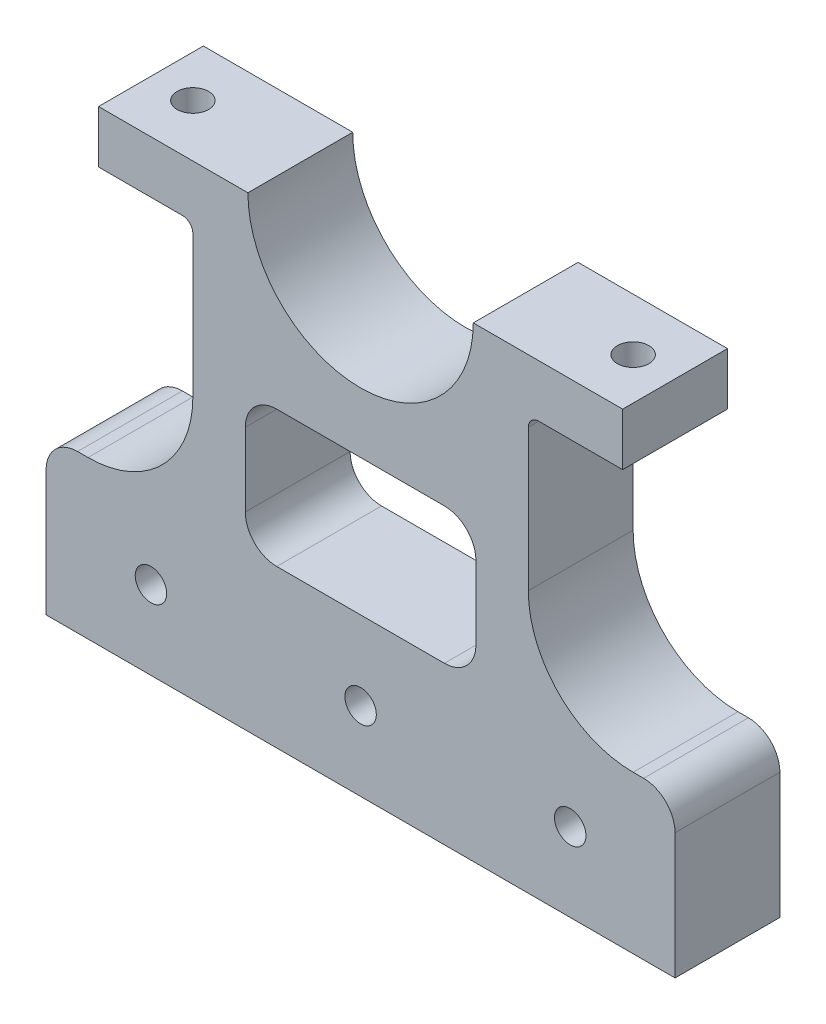
ISO-10303-21;
HEADER;
FILE_DESCRIPTION(('STEP AP214'),'2;1');
FILE_NAME('part.step','',(''),(''),'','','');
FILE_SCHEMA(('AUTOMOTIVE_DESIGN { 1 0 10303 214 1 1 1 1 }'));
ENDSEC;
DATA;
#1=APPLICATION_CONTEXT('core data for automotive mechanical design processes');
#2=APPLICATION_PROTOCOL_DEFINITION('international standard','automotive_design',2000,#1);
#3=PRODUCT_CONTEXT('',#1,'mechanical');
#4=PRODUCT('Part','Part','',(#3));
#5=PRODUCT_RELATED_PRODUCT_CATEGORY('part','',(#4));
#6=PRODUCT_DEFINITION_FORMATION('','',#4);
#7=PRODUCT_DEFINITION_CONTEXT('part definition',#1,'design');
#8=PRODUCT_DEFINITION('design','',#6,#7);
#9=PRODUCT_DEFINITION_SHAPE('','',#8);
#10=(LENGTH_UNIT() NAMED_UNIT(*) SI_UNIT(.MILLI.,.METRE.));
#11=(NAMED_UNIT(*) PLANE_ANGLE_UNIT() SI_UNIT($,.RADIAN.));
#12=(NAMED_UNIT(*) SI_UNIT($,.STERADIAN.) SOLID_ANGLE_UNIT());
#13=UNCERTAINTY_MEASURE_WITH_UNIT(LENGTH_MEASURE(1.E-05),#10,'distance_accuracy_value','');
#14=(GEOMETRIC_REPRESENTATION_CONTEXT(3) GLOBAL_UNCERTAINTY_ASSIGNED_CONTEXT((#13)) GLOBAL_UNIT_ASSIGNED_CONTEXT((#10,
#11,#12)) REPRESENTATION_CONTEXT('',''));
#15=CARTESIAN_POINT('',(0.,0.,0.));
#16=DIRECTION('',(0.,0.,1.));
#17=DIRECTION('',(1.,0.,0.));
#18=AXIS2_PLACEMENT_3D('',#15,#16,#17);
#19=CARTESIAN_POINT('',(-16.,44.5,10.));
#20=DIRECTION('',(0.,-1.,0.));
#21=DIRECTION('',(0.,0.,-1.));
#22=AXIS2_PLACEMENT_3D('',#19,#20,#21);
#23=PLANE('',#22);
#24=CARTESIAN_POINT('',(21.,44.5,5.));
#25=DIRECTION('',(0.,1.,0.));
#26=DIRECTION('',(0.,0.,-1.));
#27=AXIS2_PLACEMENT_3D('',#24,#25,#26);
#28=CIRCLE('',#27,1.5);
#29=CARTESIAN_POINT('',(21.,44.5,3.5));
#30=VERTEX_POINT('',#29);
#31=EDGE_CURVE('E661',#30,#30,#28,.T.);
#32=ORIENTED_EDGE('',*,*,#31,.F.);
#33=EDGE_LOOP('',(#32));
#34=FACE_BOUND('',#33,.T.);
#35=DIRECTION('',(-1.,0.,0.));
#36=VECTOR('',#35,1.);
#37=CARTESIAN_POINT('',(-16.,44.5,0.));
#38=LINE('',#37,#36);
#39=CARTESIAN_POINT('',(25.,44.5,0.));
#40=VERTEX_POINT('',#39);
#41=CARTESIAN_POINT('',(10.75,44.5,0.));
#42=VERTEX_POINT('',#41);
#43=EDGE_CURVE('E398',#40,#42,#38,.T.);
#44=ORIENTED_EDGE('',*,*,#43,.T.);
#45=DIRECTION('',(0.,0.,1.));
#46=VECTOR('',#45,1.);
#47=CARTESIAN_POINT('',(10.75,44.5,0.));
#48=LINE('',#47,#46);
#49=CARTESIAN_POINT('',(10.75,44.5,10.));
#50=VERTEX_POINT('',#49);
#51=EDGE_CURVE('E231',#42,#50,#48,.T.);
#52=ORIENTED_EDGE('',*,*,#51,.T.);
#53=DIRECTION('',(-1.,0.,0.));
#54=VECTOR('',#53,1.);
#55=CARTESIAN_POINT('',(-16.,44.5,10.));
#56=LINE('',#55,#54);
#57=CARTESIAN_POINT('',(25.,44.5,10.));
#58=VERTEX_POINT('',#57);
#59=EDGE_CURVE('E226',#58,#50,#56,.T.);
#60=ORIENTED_EDGE('',*,*,#59,.F.);
#61=DIRECTION('',(0.,0.,1.));
#62=VECTOR('',#61,1.);
#63=CARTESIAN_POINT('',(25.,44.5,-10.295630140987));
#64=LINE('',#63,#62);
#65=EDGE_CURVE('E229',#40,#58,#64,.T.);
#66=ORIENTED_EDGE('',*,*,#65,.F.);
#67=EDGE_LOOP('',(#44,#52,#60,#66));
#68=FACE_BOUND('',#67,.T.);
#69=ADVANCED_FACE('F41',(#34,#68),#23,.F.);
#70=CARTESIAN_POINT('',(-30.,0.,10.));
#71=DIRECTION('',(1.,0.,0.));
#72=DIRECTION('',(0.,0.,-1.));
#73=AXIS2_PLACEMENT_3D('',#70,#71,#72);
#74=PLANE('',#73);
#75=DIRECTION('',(0.,-1.,0.));
#76=VECTOR('',#75,1.);
#77=CARTESIAN_POINT('',(-30.,0.,10.));
#78=LINE('',#77,#76);
#79=CARTESIAN_POINT('',(-30.,12.,10.));
#80=VERTEX_POINT('',#79);
#81=CARTESIAN_POINT('',(-30.,0.,10.));
#82=VERTEX_POINT('',#81);
#83=EDGE_CURVE('E357',#80,#82,#78,.T.);
#84=ORIENTED_EDGE('',*,*,#83,.F.);
#85=DIRECTION('',(0.,0.,-1.));
#86=VECTOR('',#85,1.);
#87=CARTESIAN_POINT('',(-30.,12.,10.));
#88=LINE('',#87,#86);
#89=CARTESIAN_POINT('',(-30.,12.,0.));
#90=VERTEX_POINT('',#89);
#91=EDGE_CURVE('E447',#80,#90,#88,.T.);
#92=ORIENTED_EDGE('',*,*,#91,.T.);
#93=DIRECTION('',(0.,-1.,0.));
#94=VECTOR('',#93,1.);
#95=CARTESIAN_POINT('',(-30.,0.,0.));
#96=LINE('',#95,#94);
#97=CARTESIAN_POINT('',(-30.,0.,0.));
#98=VERTEX_POINT('',#97);
#99=EDGE_CURVE('E356',#90,#98,#96,.T.);
#100=ORIENTED_EDGE('',*,*,#99,.T.);
#101=DIRECTION('',(0.,0.,-1.));
#102=VECTOR('',#101,1.);
#103=CARTESIAN_POINT('',(-30.,0.,10.));
#104=LINE('',#103,#102);
#105=EDGE_CURVE('E410',#82,#98,#104,.T.);
#106=ORIENTED_EDGE('',*,*,#105,.F.);
#107=EDGE_LOOP('',(#84,#92,#100,#106));
#108=FACE_BOUND('',#107,.T.);
#109=ADVANCED_FACE('F585',(#108),#74,.F.);
#110=CARTESIAN_POINT('',(30.,0.,10.));
#111=DIRECTION('',(0.,1.,0.));
#112=DIRECTION('',(0.,0.,1.));
#113=AXIS2_PLACEMENT_3D('',#110,#111,#112);
#114=PLANE('',#113);
#115=DIRECTION('',(1.,0.,0.));
#116=VECTOR('',#115,1.);
#117=CARTESIAN_POINT('',(30.,0.,0.));
#118=LINE('',#117,#116);
#119=CARTESIAN_POINT('',(30.,0.,0.));
#120=VERTEX_POINT('',#119);
#121=EDGE_CURVE('E383',#98,#120,#118,.T.);
#122=ORIENTED_EDGE('',*,*,#121,.T.);
#123=DIRECTION('',(0.,0.,-1.));
#124=VECTOR('',#123,1.);
#125=CARTESIAN_POINT('',(30.,0.,10.));
#126=LINE('',#125,#124);
#127=CARTESIAN_POINT('',(30.,0.,10.));
#128=VERTEX_POINT('',#127);
#129=EDGE_CURVE('E380',#128,#120,#126,.T.);
#130=ORIENTED_EDGE('',*,*,#129,.F.);
#131=DIRECTION('',(1.,0.,0.));
#132=VECTOR('',#131,1.);
#133=CARTESIAN_POINT('',(30.,0.,10.));
#134=LINE('',#133,#132);
#135=EDGE_CURVE('E360',#82,#128,#134,.T.);
#136=ORIENTED_EDGE('',*,*,#135,.F.);
#137=ORIENTED_EDGE('',*,*,#105,.T.);
#138=EDGE_LOOP('',(#122,#130,#136,#137));
#139=FACE_BOUND('',#138,.T.);
#140=ADVANCED_FACE('F588',(#139),#114,.F.);
#141=CARTESIAN_POINT('',(30.,0.,10.));
#142=DIRECTION('',(-1.,0.,0.));
#143=DIRECTION('',(0.,0.,1.));
#144=AXIS2_PLACEMENT_3D('',#141,#142,#143);
#145=PLANE('',#144);
#146=DIRECTION('',(0.,1.,0.));
#147=VECTOR('',#146,1.);
#148=CARTESIAN_POINT('',(30.,0.,0.));
#149=LINE('',#148,#147);
#150=CARTESIAN_POINT('',(30.,12.,0.));
#151=VERTEX_POINT('',#150);
#152=EDGE_CURVE('E386',#120,#151,#149,.T.);
#153=ORIENTED_EDGE('',*,*,#152,.T.);
#154=DIRECTION('',(0.,0.,-1.));
#155=VECTOR('',#154,1.);
#156=CARTESIAN_POINT('',(30.,12.,10.));
#157=LINE('',#156,#155);
#158=CARTESIAN_POINT('',(30.,12.,10.));
#159=VERTEX_POINT('',#158);
#160=EDGE_CURVE('E470',#151,#159,#157,.F.);
#161=ORIENTED_EDGE('',*,*,#160,.T.);
#162=DIRECTION('',(0.,1.,0.));
#163=VECTOR('',#162,1.);
#164=CARTESIAN_POINT('',(30.,0.,10.));
#165=LINE('',#164,#163);
#166=EDGE_CURVE('E364',#128,#159,#165,.T.);
#167=ORIENTED_EDGE('',*,*,#166,.F.);
#168=ORIENTED_EDGE('',*,*,#129,.T.);
#169=EDGE_LOOP('',(#153,#161,#167,#168));
#170=FACE_BOUND('',#169,.T.);
#171=ADVANCED_FACE('F844',(#170),#145,.F.);
#172=CARTESIAN_POINT('',(30.,15.,10.));
#173=DIRECTION('',(0.,-1.,0.));
#174=DIRECTION('',(1.,0.,0.));
#175=AXIS2_PLACEMENT_3D('',#172,#173,#174);
#176=PLANE('',#175);
#177=DIRECTION('',(-1.,0.,0.));
#178=VECTOR('',#177,1.);
#179=CARTESIAN_POINT('',(30.,15.,10.));
#180=LINE('',#179,#178);
#181=CARTESIAN_POINT('',(27.,15.,10.));
#182=VERTEX_POINT('',#181);
#183=CARTESIAN_POINT('',(26.,15.,10.));
#184=VERTEX_POINT('',#183);
#185=EDGE_CURVE('E368',#182,#184,#180,.T.);
#186=ORIENTED_EDGE('',*,*,#185,.F.);
#187=DIRECTION('',(0.,0.,-1.));
#188=VECTOR('',#187,1.);
#189=CARTESIAN_POINT('',(27.,15.,10.));
#190=LINE('',#189,#188);
#191=CARTESIAN_POINT('',(27.,15.,0.));
#192=VERTEX_POINT('',#191);
#193=EDGE_CURVE('E466',#182,#192,#190,.T.);
#194=ORIENTED_EDGE('',*,*,#193,.T.);
#195=DIRECTION('',(-1.,0.,0.));
#196=VECTOR('',#195,1.);
#197=CARTESIAN_POINT('',(30.,15.,0.));
#198=LINE('',#197,#196);
#199=CARTESIAN_POINT('',(26.,15.,0.));
#200=VERTEX_POINT('',#199);
#201=EDGE_CURVE('E390',#192,#200,#198,.T.);
#202=ORIENTED_EDGE('',*,*,#201,.T.);
#203=DIRECTION('',(0.,0.,-1.));
#204=VECTOR('',#203,1.);
#205=CARTESIAN_POINT('',(26.,15.,10.));
#206=LINE('',#205,#204);
#207=EDGE_CURVE('E421',#200,#184,#206,.F.);
#208=ORIENTED_EDGE('',*,*,#207,.T.);
#209=EDGE_LOOP('',(#186,#194,#202,#208));
#210=FACE_BOUND('',#209,.T.);
#211=ADVANCED_FACE('F600',(#210),#176,.F.);
#212=CARTESIAN_POINT('',(16.,15.,10.));
#213=DIRECTION('',(-1.,0.,0.));
#214=DIRECTION('',(0.,0.,1.));
#215=AXIS2_PLACEMENT_3D('',#212,#213,#214);
#216=PLANE('',#215);
#217=DIRECTION('',(0.,1.,0.));
#218=VECTOR('',#217,1.);
#219=CARTESIAN_POINT('',(16.,15.,0.));
#220=LINE('',#219,#218);
#221=CARTESIAN_POINT('',(16.,25.,0.));
#222=VERTEX_POINT('',#221);
#223=CARTESIAN_POINT('',(16.,38.5,0.));
#224=VERTEX_POINT('',#223);
#225=EDGE_CURVE('E393',#222,#224,#220,.T.);
#226=ORIENTED_EDGE('',*,*,#225,.T.);
#227=DIRECTION('',(0.,0.,1.));
#228=VECTOR('',#227,1.);
#229=CARTESIAN_POINT('',(16.,38.5,10.));
#230=LINE('',#229,#228);
#231=CARTESIAN_POINT('',(16.,38.5,10.));
#232=VERTEX_POINT('',#231);
#233=EDGE_CURVE('E525',#224,#232,#230,.T.);
#234=ORIENTED_EDGE('',*,*,#233,.T.);
#235=DIRECTION('',(0.,1.,0.));
#236=VECTOR('',#235,1.);
#237=CARTESIAN_POINT('',(16.,15.,10.));
#238=LINE('',#237,#236);
#239=CARTESIAN_POINT('',(16.,25.,10.));
#240=VERTEX_POINT('',#239);
#241=EDGE_CURVE('E371',#240,#232,#238,.T.);
#242=ORIENTED_EDGE('',*,*,#241,.F.);
#243=DIRECTION('',(0.,0.,-1.));
#244=VECTOR('',#243,1.);
#245=CARTESIAN_POINT('',(16.,25.,0.));
#246=LINE('',#245,#244);
#247=EDGE_CURVE('E417',#240,#222,#246,.T.);
#248=ORIENTED_EDGE('',*,*,#247,.T.);
#249=EDGE_LOOP('',(#226,#234,#242,#248));
#250=FACE_BOUND('',#249,.T.);
#251=ADVANCED_FACE('F610',(#250),#216,.F.);
#252=CARTESIAN_POINT('',(-21.,44.5,5.));
#253=DIRECTION('',(0.,1.,0.));
#254=DIRECTION('',(0.,0.,1.));
#255=AXIS2_PLACEMENT_3D('',#252,#253,#254);
#256=CIRCLE('',#255,1.5);
#257=CARTESIAN_POINT('',(-21.,44.5,6.5));
#258=VERTEX_POINT('',#257);
#259=EDGE_CURVE('E652',#258,#258,#256,.T.);
#260=ORIENTED_EDGE('',*,*,#259,.F.);
#261=EDGE_LOOP('',(#260));
#262=FACE_BOUND('',#261,.T.);
#263=CARTESIAN_POINT('',(-10.75,44.5,10.));
#264=VERTEX_POINT('',#263);
#265=CARTESIAN_POINT('',(-25.,44.5,10.));
#266=VERTEX_POINT('',#265);
#267=EDGE_CURVE('E236',#264,#266,#56,.T.);
#268=ORIENTED_EDGE('',*,*,#267,.F.);
#269=DIRECTION('',(0.,0.,1.));
#270=VECTOR('',#269,1.);
#271=CARTESIAN_POINT('',(-10.75,44.5,0.));
#272=LINE('',#271,#270);
#273=CARTESIAN_POINT('',(-10.75,44.5,0.));
#274=VERTEX_POINT('',#273);
#275=EDGE_CURVE('E350',#264,#274,#272,.F.);
#276=ORIENTED_EDGE('',*,*,#275,.T.);
#277=CARTESIAN_POINT('',(-25.,44.5,0.));
#278=VERTEX_POINT('',#277);
#279=EDGE_CURVE('E397',#274,#278,#38,.T.);
#280=ORIENTED_EDGE('',*,*,#279,.T.);
#281=DIRECTION('',(0.,0.,1.));
#282=VECTOR('',#281,1.);
#283=CARTESIAN_POINT('',(-25.,44.5,-10.295630140987));
#284=LINE('',#283,#282);
#285=EDGE_CURVE('E273',#278,#266,#284,.T.);
#286=ORIENTED_EDGE('',*,*,#285,.T.);
#287=EDGE_LOOP('',(#268,#276,#280,#286));
#288=FACE_BOUND('',#287,.T.);
#289=ADVANCED_FACE('F550',(#262,#288),#23,.F.);
#290=CARTESIAN_POINT('',(-16.,15.,10.));
#291=DIRECTION('',(1.,0.,0.));
#292=DIRECTION('',(0.,0.,-1.));
#293=AXIS2_PLACEMENT_3D('',#290,#291,#292);
#294=PLANE('',#293);
#295=DIRECTION('',(0.,-1.,0.));
#296=VECTOR('',#295,1.);
#297=CARTESIAN_POINT('',(-16.,15.,10.));
#298=LINE('',#297,#296);
#299=CARTESIAN_POINT('',(-16.,38.5,10.));
#300=VERTEX_POINT('',#299);
#301=CARTESIAN_POINT('',(-16.,25.,10.));
#302=VERTEX_POINT('',#301);
#303=EDGE_CURVE('E235',#300,#302,#298,.T.);
#304=ORIENTED_EDGE('',*,*,#303,.F.);
#305=DIRECTION('',(0.,0.,1.));
#306=VECTOR('',#305,1.);
#307=CARTESIAN_POINT('',(-16.,38.5,10.));
#308=LINE('',#307,#306);
#309=CARTESIAN_POINT('',(-16.,38.5,0.));
#310=VERTEX_POINT('',#309);
#311=EDGE_CURVE('E57',#300,#310,#308,.F.);
#312=ORIENTED_EDGE('',*,*,#311,.T.);
#313=DIRECTION('',(0.,-1.,0.));
#314=VECTOR('',#313,1.);
#315=CARTESIAN_POINT('',(-16.,15.,0.));
#316=LINE('',#315,#314);
#317=CARTESIAN_POINT('',(-16.,25.,0.));
#318=VERTEX_POINT('',#317);
#319=EDGE_CURVE('E401',#310,#318,#316,.T.);
#320=ORIENTED_EDGE('',*,*,#319,.T.);
#321=DIRECTION('',(0.,0.,-1.));
#322=VECTOR('',#321,1.);
#323=CARTESIAN_POINT('',(-16.,25.,10.));
#324=LINE('',#323,#322);
#325=EDGE_CURVE('E429',#318,#302,#324,.F.);
#326=ORIENTED_EDGE('',*,*,#325,.T.);
#327=EDGE_LOOP('',(#304,#312,#320,#326));
#328=FACE_BOUND('',#327,.T.);
#329=ADVANCED_FACE('F568',(#328),#294,.F.);
#330=CARTESIAN_POINT('',(-30.,15.,10.));
#331=DIRECTION('',(0.,-1.,0.));
#332=DIRECTION('',(1.,0.,0.));
#333=AXIS2_PLACEMENT_3D('',#330,#331,#332);
#334=PLANE('',#333);
#335=DIRECTION('',(-1.,0.,0.));
#336=VECTOR('',#335,1.);
#337=CARTESIAN_POINT('',(-30.,15.,0.));
#338=LINE('',#337,#336);
#339=CARTESIAN_POINT('',(-26.,15.,0.));
#340=VERTEX_POINT('',#339);
#341=CARTESIAN_POINT('',(-27.,15.,0.));
#342=VERTEX_POINT('',#341);
#343=EDGE_CURVE('E361',#340,#342,#338,.T.);
#344=ORIENTED_EDGE('',*,*,#343,.T.);
#345=DIRECTION('',(0.,0.,-1.));
#346=VECTOR('',#345,1.);
#347=CARTESIAN_POINT('',(-27.,15.,10.));
#348=LINE('',#347,#346);
#349=CARTESIAN_POINT('',(-27.,15.,10.));
#350=VERTEX_POINT('',#349);
#351=EDGE_CURVE('E457',#342,#350,#348,.F.);
#352=ORIENTED_EDGE('',*,*,#351,.T.);
#353=DIRECTION('',(-1.,0.,0.));
#354=VECTOR('',#353,1.);
#355=CARTESIAN_POINT('',(-30.,15.,10.));
#356=LINE('',#355,#354);
#357=CARTESIAN_POINT('',(-26.,15.,10.));
#358=VERTEX_POINT('',#357);
#359=EDGE_CURVE('E377',#358,#350,#356,.T.);
#360=ORIENTED_EDGE('',*,*,#359,.F.);
#361=DIRECTION('',(0.,0.,-1.));
#362=VECTOR('',#361,1.);
#363=CARTESIAN_POINT('',(-26.,15.,0.));
#364=LINE('',#363,#362);
#365=EDGE_CURVE('E425',#358,#340,#364,.T.);
#366=ORIENTED_EDGE('',*,*,#365,.T.);
#367=EDGE_LOOP('',(#344,#352,#360,#366));
#368=FACE_BOUND('',#367,.T.);
#369=ADVANCED_FACE('F576',(#368),#334,.F.);
#370=CARTESIAN_POINT('',(0.,0.,10.));
#371=DIRECTION('',(0.,0.,-1.));
#372=DIRECTION('',(-1.,0.,0.));
#373=AXIS2_PLACEMENT_3D('',#370,#371,#372);
#374=PLANE('',#373);
#375=DIRECTION('',(-1.,0.,0.));
#376=VECTOR('',#375,1.);
#377=CARTESIAN_POINT('',(-11.,28.,10.));
#378=LINE('',#377,#376);
#379=CARTESIAN_POINT('',(7.99999999999999,28.,10.));
#380=VERTEX_POINT('',#379);
#381=CARTESIAN_POINT('',(-8.00000000000001,28.,10.));
#382=VERTEX_POINT('',#381);
#383=EDGE_CURVE('E313',#380,#382,#378,.T.);
#384=ORIENTED_EDGE('',*,*,#383,.F.);
#385=CARTESIAN_POINT('',(7.99999999999999,25.,10.));
#386=DIRECTION('',(0.,0.,-1.));
#387=DIRECTION('',(-1.,0.,0.));
#388=AXIS2_PLACEMENT_3D('',#385,#386,#387);
#389=CIRCLE('',#388,3.);
#390=CARTESIAN_POINT('',(11.,25.,10.));
#391=VERTEX_POINT('',#390);
#392=EDGE_CURVE('E513',#380,#391,#389,.T.);
#393=ORIENTED_EDGE('',*,*,#392,.T.);
#394=DIRECTION('',(0.,1.,0.));
#395=VECTOR('',#394,1.);
#396=CARTESIAN_POINT('',(11.,28.,10.));
#397=LINE('',#396,#395);
#398=CARTESIAN_POINT('',(11.,18.,10.));
#399=VERTEX_POINT('',#398);
#400=EDGE_CURVE('E281',#399,#391,#397,.T.);
#401=ORIENTED_EDGE('',*,*,#400,.F.);
#402=CARTESIAN_POINT('',(8.,18.,10.));
#403=DIRECTION('',(0.,0.,-1.));
#404=DIRECTION('',(-1.,0.,0.));
#405=AXIS2_PLACEMENT_3D('',#402,#403,#404);
#406=CIRCLE('',#405,3.);
#407=CARTESIAN_POINT('',(8.,15.,10.));
#408=VERTEX_POINT('',#407);
#409=EDGE_CURVE('E507',#399,#408,#406,.T.);
#410=ORIENTED_EDGE('',*,*,#409,.T.);
#411=DIRECTION('',(1.,0.,0.));
#412=VECTOR('',#411,1.);
#413=CARTESIAN_POINT('',(-11.,15.,10.));
#414=LINE('',#413,#412);
#415=CARTESIAN_POINT('',(-8.,15.,10.));
#416=VERTEX_POINT('',#415);
#417=EDGE_CURVE('E297',#416,#408,#414,.T.);
#418=ORIENTED_EDGE('',*,*,#417,.F.);
#419=CARTESIAN_POINT('',(-8.,18.,10.));
#420=DIRECTION('',(0.,0.,-1.));
#421=DIRECTION('',(-1.,0.,0.));
#422=AXIS2_PLACEMENT_3D('',#419,#420,#421);
#423=CIRCLE('',#422,3.);
#424=CARTESIAN_POINT('',(-11.,18.,10.));
#425=VERTEX_POINT('',#424);
#426=EDGE_CURVE('E501',#416,#425,#423,.T.);
#427=ORIENTED_EDGE('',*,*,#426,.T.);
#428=DIRECTION('',(0.,-1.,0.));
#429=VECTOR('',#428,1.);
#430=CARTESIAN_POINT('',(-11.,28.,10.));
#431=LINE('',#430,#429);
#432=CARTESIAN_POINT('',(-11.,25.,10.));
#433=VERTEX_POINT('',#432);
#434=EDGE_CURVE('E317',#433,#425,#431,.T.);
#435=ORIENTED_EDGE('',*,*,#434,.F.);
#436=CARTESIAN_POINT('',(-8.00000000000001,25.,10.));
#437=DIRECTION('',(0.,0.,-1.));
#438=DIRECTION('',(-1.,0.,0.));
#439=AXIS2_PLACEMENT_3D('',#436,#437,#438);
#440=CIRCLE('',#439,3.);
#441=EDGE_CURVE('E519',#433,#382,#440,.T.);
#442=ORIENTED_EDGE('',*,*,#441,.T.);
#443=EDGE_LOOP('',(#384,#393,#401,#410,#418,#427,#435,#442));
#444=FACE_BOUND('',#443,.T.);
#445=CARTESIAN_POINT('',(-20.,7.49999999999998,10.));
#446=DIRECTION('',(0.,0.,1.));
#447=DIRECTION('',(1.,0.,0.));
#448=AXIS2_PLACEMENT_3D('',#445,#446,#447);
#449=CIRCLE('',#448,1.5);
#450=CARTESIAN_POINT('',(-18.5,7.49999999999998,10.));
#451=VERTEX_POINT('',#450);
#452=EDGE_CURVE('E329',#451,#451,#449,.T.);
#453=ORIENTED_EDGE('',*,*,#452,.F.);
#454=EDGE_LOOP('',(#453));
#455=FACE_BOUND('',#454,.T.);
#456=CARTESIAN_POINT('',(0.,7.49999999999999,10.));
#457=DIRECTION('',(0.,0.,1.));
#458=DIRECTION('',(1.,0.,0.));
#459=AXIS2_PLACEMENT_3D('',#456,#457,#458);
#460=CIRCLE('',#459,1.5);
#461=CARTESIAN_POINT('',(1.5,7.49999999999999,10.));
#462=VERTEX_POINT('',#461);
#463=EDGE_CURVE('E337',#462,#462,#460,.T.);
#464=ORIENTED_EDGE('',*,*,#463,.F.);
#465=EDGE_LOOP('',(#464));
#466=FACE_BOUND('',#465,.T.);
#467=CARTESIAN_POINT('',(20.,7.49999999999998,10.));
#468=DIRECTION('',(0.,0.,1.));
#469=DIRECTION('',(1.,0.,0.));
#470=AXIS2_PLACEMENT_3D('',#467,#468,#469);
#471=CIRCLE('',#470,1.5);
#472=CARTESIAN_POINT('',(21.5,7.49999999999998,10.));
#473=VERTEX_POINT('',#472);
#474=EDGE_CURVE('E309',#473,#473,#471,.T.);
#475=ORIENTED_EDGE('',*,*,#474,.F.);
#476=EDGE_LOOP('',(#475));
#477=FACE_BOUND('',#476,.T.);
#478=ORIENTED_EDGE('',*,*,#359,.T.);
#479=CARTESIAN_POINT('',(-27.,12.,10.));
#480=DIRECTION('',(0.,0.,-1.));
#481=DIRECTION('',(-1.,0.,0.));
#482=AXIS2_PLACEMENT_3D('',#479,#480,#481);
#483=CIRCLE('',#482,3.);
#484=EDGE_CURVE('E463',#350,#80,#483,.F.);
#485=ORIENTED_EDGE('',*,*,#484,.T.);
#486=ORIENTED_EDGE('',*,*,#83,.T.);
#487=ORIENTED_EDGE('',*,*,#135,.T.);
#488=ORIENTED_EDGE('',*,*,#166,.T.);
#489=CARTESIAN_POINT('',(27.,12.,10.));
#490=DIRECTION('',(0.,0.,-1.));
#491=DIRECTION('',(-1.,0.,0.));
#492=AXIS2_PLACEMENT_3D('',#489,#490,#491);
#493=CIRCLE('',#492,3.);
#494=EDGE_CURVE('E460',#159,#182,#493,.F.);
#495=ORIENTED_EDGE('',*,*,#494,.T.);
#496=ORIENTED_EDGE('',*,*,#185,.T.);
#497=CARTESIAN_POINT('',(26.,25.,10.));
#498=DIRECTION('',(0.,0.,-1.));
#499=DIRECTION('',(-1.,0.,0.));
#500=AXIS2_PLACEMENT_3D('',#497,#498,#499);
#501=CIRCLE('',#500,10.);
#502=EDGE_CURVE('E437',#184,#240,#501,.T.);
#503=ORIENTED_EDGE('',*,*,#502,.T.);
#504=ORIENTED_EDGE('',*,*,#241,.T.);
#505=CARTESIAN_POINT('',(17.,38.5,10.));
#506=DIRECTION('',(0.,0.,-1.));
#507=DIRECTION('',(-1.,0.,0.));
#508=AXIS2_PLACEMENT_3D('',#505,#506,#507);
#509=CIRCLE('',#508,1.);
#510=CARTESIAN_POINT('',(17.,39.5,10.));
#511=VERTEX_POINT('',#510);
#512=EDGE_CURVE('E538',#232,#511,#509,.T.);
#513=ORIENTED_EDGE('',*,*,#512,.T.);
#514=DIRECTION('',(1.,0.,0.));
#515=VECTOR('',#514,1.);
#516=CARTESIAN_POINT('',(16.,39.5,10.));
#517=LINE('',#516,#515);
#518=CARTESIAN_POINT('',(25.,39.5,10.));
#519=VERTEX_POINT('',#518);
#520=EDGE_CURVE('E251',#511,#519,#517,.T.);
#521=ORIENTED_EDGE('',*,*,#520,.T.);
#522=DIRECTION('',(0.,1.,0.));
#523=VECTOR('',#522,1.);
#524=CARTESIAN_POINT('',(25.,44.5,10.));
#525=LINE('',#524,#523);
#526=EDGE_CURVE('E242',#519,#58,#525,.T.);
#527=ORIENTED_EDGE('',*,*,#526,.T.);
#528=ORIENTED_EDGE('',*,*,#59,.T.);
#529=CARTESIAN_POINT('',(0.,44.5,10.));
#530=DIRECTION('',(0.,0.,1.));
#531=DIRECTION('',(1.,0.,0.));
#532=AXIS2_PLACEMENT_3D('',#529,#530,#531);
#533=CIRCLE('',#532,10.75);
#534=EDGE_CURVE('E328',#264,#50,#533,.T.);
#535=ORIENTED_EDGE('',*,*,#534,.F.);
#536=ORIENTED_EDGE('',*,*,#267,.T.);
#537=DIRECTION('',(0.,-1.,0.));
#538=VECTOR('',#537,1.);
#539=CARTESIAN_POINT('',(-25.,44.5,10.));
#540=LINE('',#539,#538);
#541=CARTESIAN_POINT('',(-25.,39.5,10.));
#542=VERTEX_POINT('',#541);
#543=EDGE_CURVE('E246',#266,#542,#540,.T.);
#544=ORIENTED_EDGE('',*,*,#543,.T.);
#545=DIRECTION('',(1.,0.,0.));
#546=VECTOR('',#545,1.);
#547=CARTESIAN_POINT('',(-16.,39.5,10.));
#548=LINE('',#547,#546);
#549=CARTESIAN_POINT('',(-17.,39.5,10.));
#550=VERTEX_POINT('',#549);
#551=EDGE_CURVE('E270',#542,#550,#548,.T.);
#552=ORIENTED_EDGE('',*,*,#551,.T.);
#553=CARTESIAN_POINT('',(-17.,38.5,10.));
#554=DIRECTION('',(0.,0.,-1.));
#555=DIRECTION('',(-1.,0.,0.));
#556=AXIS2_PLACEMENT_3D('',#553,#554,#555);
#557=CIRCLE('',#556,1.);
#558=EDGE_CURVE('E50',#550,#300,#557,.T.);
#559=ORIENTED_EDGE('',*,*,#558,.T.);
#560=ORIENTED_EDGE('',*,*,#303,.T.);
#561=CARTESIAN_POINT('',(-26.,25.,10.));
#562=DIRECTION('',(0.,0.,-1.));
#563=DIRECTION('',(-1.,0.,0.));
#564=AXIS2_PLACEMENT_3D('',#561,#562,#563);
#565=CIRCLE('',#564,10.);
#566=EDGE_CURVE('E444',#302,#358,#565,.T.);
#567=ORIENTED_EDGE('',*,*,#566,.T.);
#568=EDGE_LOOP('',(#478,#485,#486,#487,#488,#495,#496,#503,#504,#513,#521,#527,#528,#535,#536,
#544,#552,#559,#560,#567));
#569=FACE_BOUND('',#568,.T.);
#570=ADVANCED_FACE('F249',(#444,#455,#466,#477,#569),#374,.F.);
#571=CARTESIAN_POINT('',(0.,0.,0.));
#572=DIRECTION('',(0.,0.,-1.));
#573=DIRECTION('',(-1.,0.,0.));
#574=AXIS2_PLACEMENT_3D('',#571,#572,#573);
#575=PLANE('',#574);
#576=DIRECTION('',(1.,0.,0.));
#577=VECTOR('',#576,1.);
#578=CARTESIAN_POINT('',(-11.,15.,0.));
#579=LINE('',#578,#577);
#580=CARTESIAN_POINT('',(-8.,15.,0.));
#581=VERTEX_POINT('',#580);
#582=CARTESIAN_POINT('',(8.,15.,0.));
#583=VERTEX_POINT('',#582);
#584=EDGE_CURVE('E305',#581,#583,#579,.T.);
#585=ORIENTED_EDGE('',*,*,#584,.T.);
#586=CARTESIAN_POINT('',(8.,18.,0.));
#587=DIRECTION('',(0.,0.,-1.));
#588=DIRECTION('',(-1.,0.,0.));
#589=AXIS2_PLACEMENT_3D('',#586,#587,#588);
#590=CIRCLE('',#589,3.);
#591=CARTESIAN_POINT('',(11.,18.,0.));
#592=VERTEX_POINT('',#591);
#593=EDGE_CURVE('E510',#583,#592,#590,.F.);
#594=ORIENTED_EDGE('',*,*,#593,.T.);
#595=DIRECTION('',(0.,1.,0.));
#596=VECTOR('',#595,1.);
#597=CARTESIAN_POINT('',(11.,28.,0.));
#598=LINE('',#597,#596);
#599=CARTESIAN_POINT('',(11.,25.,0.));
#600=VERTEX_POINT('',#599);
#601=EDGE_CURVE('E292',#592,#600,#598,.T.);
#602=ORIENTED_EDGE('',*,*,#601,.T.);
#603=CARTESIAN_POINT('',(7.99999999999999,25.,0.));
#604=DIRECTION('',(0.,0.,-1.));
#605=DIRECTION('',(-1.,0.,0.));
#606=AXIS2_PLACEMENT_3D('',#603,#604,#605);
#607=CIRCLE('',#606,3.);
#608=CARTESIAN_POINT('',(7.99999999999999,28.,0.));
#609=VERTEX_POINT('',#608);
#610=EDGE_CURVE('E516',#600,#609,#607,.F.);
#611=ORIENTED_EDGE('',*,*,#610,.T.);
#612=DIRECTION('',(-1.,0.,0.));
#613=VECTOR('',#612,1.);
#614=CARTESIAN_POINT('',(-11.,28.,0.));
#615=LINE('',#614,#613);
#616=CARTESIAN_POINT('',(-8.00000000000001,28.,0.));
#617=VERTEX_POINT('',#616);
#618=EDGE_CURVE('E296',#609,#617,#615,.T.);
#619=ORIENTED_EDGE('',*,*,#618,.T.);
#620=CARTESIAN_POINT('',(-8.00000000000001,25.,0.));
#621=DIRECTION('',(0.,0.,-1.));
#622=DIRECTION('',(-1.,0.,0.));
#623=AXIS2_PLACEMENT_3D('',#620,#621,#622);
#624=CIRCLE('',#623,3.);
#625=CARTESIAN_POINT('',(-11.,25.,0.));
#626=VERTEX_POINT('',#625);
#627=EDGE_CURVE('E522',#617,#626,#624,.F.);
#628=ORIENTED_EDGE('',*,*,#627,.T.);
#629=DIRECTION('',(0.,-1.,0.));
#630=VECTOR('',#629,1.);
#631=CARTESIAN_POINT('',(-11.,28.,0.));
#632=LINE('',#631,#630);
#633=CARTESIAN_POINT('',(-11.,18.,0.));
#634=VERTEX_POINT('',#633);
#635=EDGE_CURVE('E301',#626,#634,#632,.T.);
#636=ORIENTED_EDGE('',*,*,#635,.T.);
#637=CARTESIAN_POINT('',(-8.,18.,0.));
#638=DIRECTION('',(0.,0.,-1.));
#639=DIRECTION('',(-1.,0.,0.));
#640=AXIS2_PLACEMENT_3D('',#637,#638,#639);
#641=CIRCLE('',#640,3.);
#642=EDGE_CURVE('E504',#634,#581,#641,.F.);
#643=ORIENTED_EDGE('',*,*,#642,.T.);
#644=EDGE_LOOP('',(#585,#594,#602,#611,#619,#628,#636,#643));
#645=FACE_BOUND('',#644,.T.);
#646=CARTESIAN_POINT('',(-20.,7.49999999999998,0.));
#647=DIRECTION('',(0.,0.,1.));
#648=DIRECTION('',(1.,0.,0.));
#649=AXIS2_PLACEMENT_3D('',#646,#647,#648);
#650=CIRCLE('',#649,1.5);
#651=CARTESIAN_POINT('',(-18.5,7.49999999999998,0.));
#652=VERTEX_POINT('',#651);
#653=EDGE_CURVE('E324',#652,#652,#650,.T.);
#654=ORIENTED_EDGE('',*,*,#653,.T.);
#655=EDGE_LOOP('',(#654));
#656=FACE_BOUND('',#655,.T.);
#657=CARTESIAN_POINT('',(0.,7.49999999999999,0.));
#658=DIRECTION('',(0.,0.,1.));
#659=DIRECTION('',(1.,0.,0.));
#660=AXIS2_PLACEMENT_3D('',#657,#658,#659);
#661=CIRCLE('',#660,1.5);
#662=CARTESIAN_POINT('',(1.5,7.49999999999999,0.));
#663=VERTEX_POINT('',#662);
#664=EDGE_CURVE('E333',#663,#663,#661,.T.);
#665=ORIENTED_EDGE('',*,*,#664,.T.);
#666=EDGE_LOOP('',(#665));
#667=FACE_BOUND('',#666,.T.);
#668=CARTESIAN_POINT('',(20.,7.49999999999998,0.));
#669=DIRECTION('',(0.,0.,1.));
#670=DIRECTION('',(1.,0.,0.));
#671=AXIS2_PLACEMENT_3D('',#668,#669,#670);
#672=CIRCLE('',#671,1.5);
#673=CARTESIAN_POINT('',(21.5,7.49999999999998,0.));
#674=VERTEX_POINT('',#673);
#675=EDGE_CURVE('E341',#674,#674,#672,.T.);
#676=ORIENTED_EDGE('',*,*,#675,.T.);
#677=EDGE_LOOP('',(#676));
#678=FACE_BOUND('',#677,.T.);
#679=ORIENTED_EDGE('',*,*,#99,.F.);
#680=CARTESIAN_POINT('',(-27.,12.,0.));
#681=DIRECTION('',(0.,0.,-1.));
#682=DIRECTION('',(-1.,0.,0.));
#683=AXIS2_PLACEMENT_3D('',#680,#681,#682);
#684=CIRCLE('',#683,3.);
#685=EDGE_CURVE('E454',#90,#342,#684,.T.);
#686=ORIENTED_EDGE('',*,*,#685,.T.);
#687=ORIENTED_EDGE('',*,*,#343,.F.);
#688=CARTESIAN_POINT('',(-26.,25.,0.));
#689=DIRECTION('',(0.,0.,-1.));
#690=DIRECTION('',(-1.,0.,0.));
#691=AXIS2_PLACEMENT_3D('',#688,#689,#690);
#692=CIRCLE('',#691,10.);
#693=EDGE_CURVE('E440',#340,#318,#692,.F.);
#694=ORIENTED_EDGE('',*,*,#693,.T.);
#695=ORIENTED_EDGE('',*,*,#319,.F.);
#696=CARTESIAN_POINT('',(-17.,38.5,0.));
#697=DIRECTION('',(0.,0.,-1.));
#698=DIRECTION('',(-1.,0.,0.));
#699=AXIS2_PLACEMENT_3D('',#696,#697,#698);
#700=CIRCLE('',#699,1.);
#701=CARTESIAN_POINT('',(-17.,39.5,0.));
#702=VERTEX_POINT('',#701);
#703=EDGE_CURVE('E11',#310,#702,#700,.F.);
#704=ORIENTED_EDGE('',*,*,#703,.T.);
#705=DIRECTION('',(1.,0.,0.));
#706=VECTOR('',#705,1.);
#707=CARTESIAN_POINT('',(-16.,39.5,0.));
#708=LINE('',#707,#706);
#709=CARTESIAN_POINT('',(-25.,39.5,0.));
#710=VERTEX_POINT('',#709);
#711=EDGE_CURVE('E277',#710,#702,#708,.T.);
#712=ORIENTED_EDGE('',*,*,#711,.F.);
#713=DIRECTION('',(0.,-1.,0.));
#714=VECTOR('',#713,1.);
#715=CARTESIAN_POINT('',(-25.,44.5,0.));
#716=LINE('',#715,#714);
#717=EDGE_CURVE('E283',#278,#710,#716,.T.);
#718=ORIENTED_EDGE('',*,*,#717,.F.);
#719=ORIENTED_EDGE('',*,*,#279,.F.);
#720=CARTESIAN_POINT('',(0.,44.5,0.));
#721=DIRECTION('',(0.,0.,-1.));
#722=DIRECTION('',(-1.,0.,0.));
#723=AXIS2_PLACEMENT_3D('',#720,#721,#722);
#724=CIRCLE('',#723,10.75);
#725=EDGE_CURVE('E414',#42,#274,#724,.T.);
#726=ORIENTED_EDGE('',*,*,#725,.F.);
#727=ORIENTED_EDGE('',*,*,#43,.F.);
#728=DIRECTION('',(0.,1.,0.));
#729=VECTOR('',#728,1.);
#730=CARTESIAN_POINT('',(25.,44.5,0.));
#731=LINE('',#730,#729);
#732=CARTESIAN_POINT('',(25.,39.5,0.));
#733=VERTEX_POINT('',#732);
#734=EDGE_CURVE('E244',#733,#40,#731,.T.);
#735=ORIENTED_EDGE('',*,*,#734,.F.);
#736=DIRECTION('',(1.,0.,0.));
#737=VECTOR('',#736,1.);
#738=CARTESIAN_POINT('',(16.,39.5,0.));
#739=LINE('',#738,#737);
#740=CARTESIAN_POINT('',(17.,39.5,0.));
#741=VERTEX_POINT('',#740);
#742=EDGE_CURVE('E254',#741,#733,#739,.T.);
#743=ORIENTED_EDGE('',*,*,#742,.F.);
#744=CARTESIAN_POINT('',(17.,38.5,0.));
#745=DIRECTION('',(0.,0.,-1.));
#746=DIRECTION('',(-1.,0.,0.));
#747=AXIS2_PLACEMENT_3D('',#744,#745,#746);
#748=CIRCLE('',#747,1.);
#749=EDGE_CURVE('E541',#741,#224,#748,.F.);
#750=ORIENTED_EDGE('',*,*,#749,.T.);
#751=ORIENTED_EDGE('',*,*,#225,.F.);
#752=CARTESIAN_POINT('',(26.,25.,0.));
#753=DIRECTION('',(0.,0.,-1.));
#754=DIRECTION('',(-1.,0.,0.));
#755=AXIS2_PLACEMENT_3D('',#752,#753,#754);
#756=CIRCLE('',#755,10.);
#757=EDGE_CURVE('E433',#222,#200,#756,.F.);
#758=ORIENTED_EDGE('',*,*,#757,.T.);
#759=ORIENTED_EDGE('',*,*,#201,.F.);
#760=CARTESIAN_POINT('',(27.,12.,0.));
#761=DIRECTION('',(0.,0.,-1.));
#762=DIRECTION('',(-1.,0.,0.));
#763=AXIS2_PLACEMENT_3D('',#760,#761,#762);
#764=CIRCLE('',#763,3.);
#765=EDGE_CURVE('E451',#192,#151,#764,.T.);
#766=ORIENTED_EDGE('',*,*,#765,.T.);
#767=ORIENTED_EDGE('',*,*,#152,.F.);
#768=ORIENTED_EDGE('',*,*,#121,.F.);
#769=EDGE_LOOP('',(#679,#686,#687,#694,#695,#704,#712,#718,#719,#726,#727,#735,#743,#750,#751,
#758,#759,#766,#767,#768));
#770=FACE_BOUND('',#769,.T.);
#771=ADVANCED_FACE('F556',(#645,#656,#667,#678,#770),#575,.T.);
#772=CARTESIAN_POINT('',(0.,44.5,0.));
#773=DIRECTION('',(0.,0.,1.));
#774=DIRECTION('',(1.,0.,0.));
#775=AXIS2_PLACEMENT_3D('',#772,#773,#774);
#776=CYLINDRICAL_SURFACE('',#775,10.75);
#777=ORIENTED_EDGE('',*,*,#725,.T.);
#778=ORIENTED_EDGE('',*,*,#275,.F.);
#779=ORIENTED_EDGE('',*,*,#534,.T.);
#780=ORIENTED_EDGE('',*,*,#51,.F.);
#781=EDGE_LOOP('',(#777,#778,#779,#780));
#782=FACE_BOUND('',#781,.T.);
#783=ADVANCED_FACE('F620',(#782),#776,.F.);
#784=CARTESIAN_POINT('',(20.,7.49999999999998,0.));
#785=DIRECTION('',(0.,0.,1.));
#786=DIRECTION('',(1.,0.,0.));
#787=AXIS2_PLACEMENT_3D('',#784,#785,#786);
#788=CYLINDRICAL_SURFACE('',#787,1.5);
#789=ORIENTED_EDGE('',*,*,#675,.F.);
#790=EDGE_LOOP('',(#789));
#791=FACE_BOUND('',#790,.T.);
#792=ORIENTED_EDGE('',*,*,#474,.T.);
#793=EDGE_LOOP('',(#792));
#794=FACE_BOUND('',#793,.T.);
#795=ADVANCED_FACE('F622',(#791,#794),#788,.F.);
#796=CARTESIAN_POINT('',(0.,7.49999999999999,0.));
#797=DIRECTION('',(0.,0.,1.));
#798=DIRECTION('',(1.,0.,0.));
#799=AXIS2_PLACEMENT_3D('',#796,#797,#798);
#800=CYLINDRICAL_SURFACE('',#799,1.5);
#801=ORIENTED_EDGE('',*,*,#664,.F.);
#802=EDGE_LOOP('',(#801));
#803=FACE_BOUND('',#802,.T.);
#804=ORIENTED_EDGE('',*,*,#463,.T.);
#805=EDGE_LOOP('',(#804));
#806=FACE_BOUND('',#805,.T.);
#807=ADVANCED_FACE('F628',(#803,#806),#800,.F.);
#808=CARTESIAN_POINT('',(-20.,7.49999999999998,0.));
#809=DIRECTION('',(0.,0.,1.));
#810=DIRECTION('',(1.,0.,0.));
#811=AXIS2_PLACEMENT_3D('',#808,#809,#810);
#812=CYLINDRICAL_SURFACE('',#811,1.5);
#813=ORIENTED_EDGE('',*,*,#653,.F.);
#814=EDGE_LOOP('',(#813));
#815=FACE_BOUND('',#814,.T.);
#816=ORIENTED_EDGE('',*,*,#452,.T.);
#817=EDGE_LOOP('',(#816));
#818=FACE_BOUND('',#817,.T.);
#819=ADVANCED_FACE('F702',(#815,#818),#812,.F.);
#820=CARTESIAN_POINT('',(26.,25.,10.));
#821=DIRECTION('',(0.,0.,1.));
#822=DIRECTION('',(1.,0.,0.));
#823=AXIS2_PLACEMENT_3D('',#820,#821,#822);
#824=CYLINDRICAL_SURFACE('',#823,10.);
#825=ORIENTED_EDGE('',*,*,#502,.F.);
#826=ORIENTED_EDGE('',*,*,#207,.F.);
#827=ORIENTED_EDGE('',*,*,#757,.F.);
#828=ORIENTED_EDGE('',*,*,#247,.F.);
#829=EDGE_LOOP('',(#825,#826,#827,#828));
#830=FACE_BOUND('',#829,.T.);
#831=ADVANCED_FACE('F607',(#830),#824,.F.);
#832=CARTESIAN_POINT('',(-26.,25.,10.));
#833=DIRECTION('',(0.,0.,1.));
#834=DIRECTION('',(1.,0.,0.));
#835=AXIS2_PLACEMENT_3D('',#832,#833,#834);
#836=CYLINDRICAL_SURFACE('',#835,10.);
#837=ORIENTED_EDGE('',*,*,#566,.F.);
#838=ORIENTED_EDGE('',*,*,#325,.F.);
#839=ORIENTED_EDGE('',*,*,#693,.F.);
#840=ORIENTED_EDGE('',*,*,#365,.F.);
#841=EDGE_LOOP('',(#837,#838,#839,#840));
#842=FACE_BOUND('',#841,.T.);
#843=ADVANCED_FACE('F572',(#842),#836,.F.);
#844=CARTESIAN_POINT('',(-27.,12.,10.));
#845=DIRECTION('',(0.,0.,-1.));
#846=DIRECTION('',(-1.,0.,0.));
#847=AXIS2_PLACEMENT_3D('',#844,#845,#846);
#848=CYLINDRICAL_SURFACE('',#847,3.);
#849=ORIENTED_EDGE('',*,*,#484,.F.);
#850=ORIENTED_EDGE('',*,*,#351,.F.);
#851=ORIENTED_EDGE('',*,*,#685,.F.);
#852=ORIENTED_EDGE('',*,*,#91,.F.);
#853=EDGE_LOOP('',(#849,#850,#851,#852));
#854=FACE_BOUND('',#853,.T.);
#855=ADVANCED_FACE('F579',(#854),#848,.T.);
#856=CARTESIAN_POINT('',(27.,12.,10.));
#857=DIRECTION('',(0.,0.,-1.));
#858=DIRECTION('',(-1.,0.,0.));
#859=AXIS2_PLACEMENT_3D('',#856,#857,#858);
#860=CYLINDRICAL_SURFACE('',#859,3.);
#861=ORIENTED_EDGE('',*,*,#494,.F.);
#862=ORIENTED_EDGE('',*,*,#160,.F.);
#863=ORIENTED_EDGE('',*,*,#765,.F.);
#864=ORIENTED_EDGE('',*,*,#193,.F.);
#865=EDGE_LOOP('',(#861,#862,#863,#864));
#866=FACE_BOUND('',#865,.T.);
#867=ADVANCED_FACE('F597',(#866),#860,.T.);
#868=CARTESIAN_POINT('',(11.,28.,0.));
#869=DIRECTION('',(1.,0.,0.));
#870=DIRECTION('',(0.,1.,0.));
#871=AXIS2_PLACEMENT_3D('',#868,#869,#870);
#872=PLANE('',#871);
#873=ORIENTED_EDGE('',*,*,#601,.F.);
#874=DIRECTION('',(0.,0.,1.));
#875=VECTOR('',#874,1.);
#876=CARTESIAN_POINT('',(11.,18.,10.));
#877=LINE('',#876,#875);
#878=EDGE_CURVE('E490',#592,#399,#877,.T.);
#879=ORIENTED_EDGE('',*,*,#878,.T.);
#880=ORIENTED_EDGE('',*,*,#400,.T.);
#881=DIRECTION('',(0.,0.,1.));
#882=VECTOR('',#881,1.);
#883=CARTESIAN_POINT('',(11.,25.,0.));
#884=LINE('',#883,#882);
#885=EDGE_CURVE('E487',#391,#600,#884,.F.);
#886=ORIENTED_EDGE('',*,*,#885,.T.);
#887=EDGE_LOOP('',(#873,#879,#880,#886));
#888=FACE_BOUND('',#887,.T.);
#889=ADVANCED_FACE('F689',(#888),#872,.F.);
#890=CARTESIAN_POINT('',(-11.,15.,0.));
#891=DIRECTION('',(0.,-1.,0.));
#892=DIRECTION('',(0.,0.,-1.));
#893=AXIS2_PLACEMENT_3D('',#890,#891,#892);
#894=PLANE('',#893);
#895=ORIENTED_EDGE('',*,*,#584,.F.);
#896=DIRECTION('',(0.,0.,1.));
#897=VECTOR('',#896,1.);
#898=CARTESIAN_POINT('',(-8.,15.,10.));
#899=LINE('',#898,#897);
#900=EDGE_CURVE('E476',#581,#416,#899,.T.);
#901=ORIENTED_EDGE('',*,*,#900,.T.);
#902=ORIENTED_EDGE('',*,*,#417,.T.);
#903=DIRECTION('',(0.,0.,1.));
#904=VECTOR('',#903,1.);
#905=CARTESIAN_POINT('',(8.,15.,0.));
#906=LINE('',#905,#904);
#907=EDGE_CURVE('E473',#408,#583,#906,.F.);
#908=ORIENTED_EDGE('',*,*,#907,.T.);
#909=EDGE_LOOP('',(#895,#901,#902,#908));
#910=FACE_BOUND('',#909,.T.);
#911=ADVANCED_FACE('F685',(#910),#894,.F.);
#912=CARTESIAN_POINT('',(-11.,28.,0.));
#913=DIRECTION('',(-1.,0.,0.));
#914=DIRECTION('',(0.,-1.,0.));
#915=AXIS2_PLACEMENT_3D('',#912,#913,#914);
#916=PLANE('',#915);
#917=ORIENTED_EDGE('',*,*,#434,.T.);
#918=DIRECTION('',(0.,0.,1.));
#919=VECTOR('',#918,1.);
#920=CARTESIAN_POINT('',(-11.,18.,0.));
#921=LINE('',#920,#919);
#922=EDGE_CURVE('E484',#425,#634,#921,.F.);
#923=ORIENTED_EDGE('',*,*,#922,.T.);
#924=ORIENTED_EDGE('',*,*,#635,.F.);
#925=DIRECTION('',(0.,0.,1.));
#926=VECTOR('',#925,1.);
#927=CARTESIAN_POINT('',(-11.,25.,10.));
#928=LINE('',#927,#926);
#929=EDGE_CURVE('E480',#626,#433,#928,.T.);
#930=ORIENTED_EDGE('',*,*,#929,.T.);
#931=EDGE_LOOP('',(#917,#923,#924,#930));
#932=FACE_BOUND('',#931,.T.);
#933=ADVANCED_FACE('F688',(#932),#916,.F.);
#934=CARTESIAN_POINT('',(-11.,28.,0.));
#935=DIRECTION('',(0.,1.,0.));
#936=DIRECTION('',(0.,0.,1.));
#937=AXIS2_PLACEMENT_3D('',#934,#935,#936);
#938=PLANE('',#937);
#939=ORIENTED_EDGE('',*,*,#618,.F.);
#940=DIRECTION('',(0.,0.,1.));
#941=VECTOR('',#940,1.);
#942=CARTESIAN_POINT('',(7.99999999999999,28.,10.));
#943=LINE('',#942,#941);
#944=EDGE_CURVE('E497',#609,#380,#943,.T.);
#945=ORIENTED_EDGE('',*,*,#944,.T.);
#946=ORIENTED_EDGE('',*,*,#383,.T.);
#947=DIRECTION('',(0.,0.,1.));
#948=VECTOR('',#947,1.);
#949=CARTESIAN_POINT('',(-8.00000000000001,28.,0.));
#950=LINE('',#949,#948);
#951=EDGE_CURVE('E494',#382,#617,#950,.F.);
#952=ORIENTED_EDGE('',*,*,#951,.T.);
#953=EDGE_LOOP('',(#939,#945,#946,#952));
#954=FACE_BOUND('',#953,.T.);
#955=ADVANCED_FACE('F693',(#954),#938,.F.);
#956=CARTESIAN_POINT('',(-8.,18.,0.));
#957=DIRECTION('',(0.,0.,-1.));
#958=DIRECTION('',(-1.,0.,0.));
#959=AXIS2_PLACEMENT_3D('',#956,#957,#958);
#960=CYLINDRICAL_SURFACE('',#959,3.);
#961=ORIENTED_EDGE('',*,*,#642,.F.);
#962=ORIENTED_EDGE('',*,*,#922,.F.);
#963=ORIENTED_EDGE('',*,*,#426,.F.);
#964=ORIENTED_EDGE('',*,*,#900,.F.);
#965=EDGE_LOOP('',(#961,#962,#963,#964));
#966=FACE_BOUND('',#965,.T.);
#967=ADVANCED_FACE('F697',(#966),#960,.F.);
#968=CARTESIAN_POINT('',(8.,18.,0.));
#969=DIRECTION('',(0.,0.,-1.));
#970=DIRECTION('',(-1.,0.,0.));
#971=AXIS2_PLACEMENT_3D('',#968,#969,#970);
#972=CYLINDRICAL_SURFACE('',#971,3.);
#973=ORIENTED_EDGE('',*,*,#593,.F.);
#974=ORIENTED_EDGE('',*,*,#907,.F.);
#975=ORIENTED_EDGE('',*,*,#409,.F.);
#976=ORIENTED_EDGE('',*,*,#878,.F.);
#977=EDGE_LOOP('',(#973,#974,#975,#976));
#978=FACE_BOUND('',#977,.T.);
#979=ADVANCED_FACE('F746',(#978),#972,.F.);
#980=CARTESIAN_POINT('',(7.99999999999999,25.,0.));
#981=DIRECTION('',(0.,0.,-1.));
#982=DIRECTION('',(-1.,0.,0.));
#983=AXIS2_PLACEMENT_3D('',#980,#981,#982);
#984=CYLINDRICAL_SURFACE('',#983,3.);
#985=ORIENTED_EDGE('',*,*,#610,.F.);
#986=ORIENTED_EDGE('',*,*,#885,.F.);
#987=ORIENTED_EDGE('',*,*,#392,.F.);
#988=ORIENTED_EDGE('',*,*,#944,.F.);
#989=EDGE_LOOP('',(#985,#986,#987,#988));
#990=FACE_BOUND('',#989,.T.);
#991=ADVANCED_FACE('F752',(#990),#984,.F.);
#992=CARTESIAN_POINT('',(-8.00000000000001,25.,0.));
#993=DIRECTION('',(0.,0.,-1.));
#994=DIRECTION('',(-1.,0.,0.));
#995=AXIS2_PLACEMENT_3D('',#992,#993,#994);
#996=CYLINDRICAL_SURFACE('',#995,3.);
#997=ORIENTED_EDGE('',*,*,#627,.F.);
#998=ORIENTED_EDGE('',*,*,#951,.F.);
#999=ORIENTED_EDGE('',*,*,#441,.F.);
#1000=ORIENTED_EDGE('',*,*,#929,.F.);
#1001=EDGE_LOOP('',(#997,#998,#999,#1000));
#1002=FACE_BOUND('',#1001,.T.);
#1003=ADVANCED_FACE('F684',(#1002),#996,.F.);
#1004=CARTESIAN_POINT('',(-25.,44.5,-10.295630140987));
#1005=DIRECTION('',(-1.,0.,0.));
#1006=DIRECTION('',(0.,0.,1.));
#1007=AXIS2_PLACEMENT_3D('',#1004,#1005,#1006);
#1008=PLANE('',#1007);
#1009=ORIENTED_EDGE('',*,*,#285,.F.);
#1010=ORIENTED_EDGE('',*,*,#717,.T.);
#1011=DIRECTION('',(0.,0.,1.));
#1012=VECTOR('',#1011,1.);
#1013=CARTESIAN_POINT('',(-25.,39.5,-10.295630140987));
#1014=LINE('',#1013,#1012);
#1015=EDGE_CURVE('E282',#710,#542,#1014,.T.);
#1016=ORIENTED_EDGE('',*,*,#1015,.T.);
#1017=ORIENTED_EDGE('',*,*,#543,.F.);
#1018=EDGE_LOOP('',(#1009,#1010,#1016,#1017));
#1019=FACE_BOUND('',#1018,.T.);
#1020=ADVANCED_FACE('F559',(#1019),#1008,.T.);
#1021=CARTESIAN_POINT('',(-16.,39.5,-10.295630140987));
#1022=DIRECTION('',(0.,-1.,0.));
#1023=DIRECTION('',(0.,0.,-1.));
#1024=AXIS2_PLACEMENT_3D('',#1021,#1022,#1023);
#1025=PLANE('',#1024);
#1026=CARTESIAN_POINT('',(-21.,39.5,5.));
#1027=DIRECTION('',(0.,-1.,0.));
#1028=DIRECTION('',(0.,0.,-1.));
#1029=AXIS2_PLACEMENT_3D('',#1026,#1027,#1028);
#1030=CIRCLE('',#1029,1.5);
#1031=CARTESIAN_POINT('',(-21.,39.5,3.5));
#1032=VERTEX_POINT('',#1031);
#1033=EDGE_CURVE('E260',#1032,#1032,#1030,.F.);
#1034=ORIENTED_EDGE('',*,*,#1033,.T.);
#1035=EDGE_LOOP('',(#1034));
#1036=FACE_BOUND('',#1035,.T.);
#1037=ORIENTED_EDGE('',*,*,#711,.T.);
#1038=DIRECTION('',(0.,0.,1.));
#1039=VECTOR('',#1038,1.);
#1040=CARTESIAN_POINT('',(-17.,39.5,-10.295630140987));
#1041=LINE('',#1040,#1039);
#1042=EDGE_CURVE('E532',#702,#550,#1041,.T.);
#1043=ORIENTED_EDGE('',*,*,#1042,.T.);
#1044=ORIENTED_EDGE('',*,*,#551,.F.);
#1045=ORIENTED_EDGE('',*,*,#1015,.F.);
#1046=EDGE_LOOP('',(#1037,#1043,#1044,#1045));
#1047=FACE_BOUND('',#1046,.T.);
#1048=ADVANCED_FACE('F562',(#1036,#1047),#1025,.T.);
#1049=CARTESIAN_POINT('',(16.,39.5,-10.295630140987));
#1050=DIRECTION('',(0.,-1.,0.));
#1051=DIRECTION('',(0.,0.,-1.));
#1052=AXIS2_PLACEMENT_3D('',#1049,#1050,#1051);
#1053=PLANE('',#1052);
#1054=CARTESIAN_POINT('',(21.,39.5,5.));
#1055=DIRECTION('',(0.,-1.,0.));
#1056=DIRECTION('',(0.,0.,-1.));
#1057=AXIS2_PLACEMENT_3D('',#1054,#1055,#1056);
#1058=CIRCLE('',#1057,1.5);
#1059=CARTESIAN_POINT('',(21.,39.5,3.5));
#1060=VERTEX_POINT('',#1059);
#1061=EDGE_CURVE('E263',#1060,#1060,#1058,.F.);
#1062=ORIENTED_EDGE('',*,*,#1061,.T.);
#1063=EDGE_LOOP('',(#1062));
#1064=FACE_BOUND('',#1063,.T.);
#1065=ORIENTED_EDGE('',*,*,#520,.F.);
#1066=DIRECTION('',(0.,0.,1.));
#1067=VECTOR('',#1066,1.);
#1068=CARTESIAN_POINT('',(17.,39.5,-10.295630140987));
#1069=LINE('',#1068,#1067);
#1070=EDGE_CURVE('E529',#511,#741,#1069,.F.);
#1071=ORIENTED_EDGE('',*,*,#1070,.T.);
#1072=ORIENTED_EDGE('',*,*,#742,.T.);
#1073=DIRECTION('',(0.,0.,1.));
#1074=VECTOR('',#1073,1.);
#1075=CARTESIAN_POINT('',(25.,39.5,-10.295630140987));
#1076=LINE('',#1075,#1074);
#1077=EDGE_CURVE('E258',#733,#519,#1076,.T.);
#1078=ORIENTED_EDGE('',*,*,#1077,.T.);
#1079=EDGE_LOOP('',(#1065,#1071,#1072,#1078));
#1080=FACE_BOUND('',#1079,.T.);
#1081=ADVANCED_FACE('F617',(#1064,#1080),#1053,.T.);
#1082=CARTESIAN_POINT('',(25.,44.5,-10.295630140987));
#1083=DIRECTION('',(1.,0.,0.));
#1084=DIRECTION('',(0.,0.,-1.));
#1085=AXIS2_PLACEMENT_3D('',#1082,#1083,#1084);
#1086=PLANE('',#1085);
#1087=ORIENTED_EDGE('',*,*,#1077,.F.);
#1088=ORIENTED_EDGE('',*,*,#734,.T.);
#1089=ORIENTED_EDGE('',*,*,#65,.T.);
#1090=ORIENTED_EDGE('',*,*,#526,.F.);
#1091=EDGE_LOOP('',(#1087,#1088,#1089,#1090));
#1092=FACE_BOUND('',#1091,.T.);
#1093=ADVANCED_FACE('F241',(#1092),#1086,.T.);
#1094=CARTESIAN_POINT('',(17.,38.5,10.));
#1095=DIRECTION('',(0.,0.,1.));
#1096=DIRECTION('',(1.,0.,0.));
#1097=AXIS2_PLACEMENT_3D('',#1094,#1095,#1096);
#1098=CYLINDRICAL_SURFACE('',#1097,1.);
#1099=ORIENTED_EDGE('',*,*,#749,.F.);
#1100=ORIENTED_EDGE('',*,*,#1070,.F.);
#1101=ORIENTED_EDGE('',*,*,#512,.F.);
#1102=ORIENTED_EDGE('',*,*,#233,.F.);
#1103=EDGE_LOOP('',(#1099,#1100,#1101,#1102));
#1104=FACE_BOUND('',#1103,.T.);
#1105=ADVANCED_FACE('F614',(#1104),#1098,.F.);
#1106=CARTESIAN_POINT('',(-17.,38.5,-10.295630140987));
#1107=DIRECTION('',(0.,0.,1.));
#1108=DIRECTION('',(1.,0.,0.));
#1109=AXIS2_PLACEMENT_3D('',#1106,#1107,#1108);
#1110=CYLINDRICAL_SURFACE('',#1109,1.);
#1111=ORIENTED_EDGE('',*,*,#703,.F.);
#1112=ORIENTED_EDGE('',*,*,#311,.F.);
#1113=ORIENTED_EDGE('',*,*,#558,.F.);
#1114=ORIENTED_EDGE('',*,*,#1042,.F.);
#1115=EDGE_LOOP('',(#1111,#1112,#1113,#1114));
#1116=FACE_BOUND('',#1115,.T.);
#1117=ADVANCED_FACE('F43',(#1116),#1110,.F.);
#1118=CARTESIAN_POINT('',(21.,35.2573593128807,5.));
#1119=DIRECTION('',(0.,1.,0.));
#1120=DIRECTION('',(0.,0.,1.));
#1121=AXIS2_PLACEMENT_3D('',#1118,#1119,#1120);
#1122=CYLINDRICAL_SURFACE('',#1121,1.5);
#1123=ORIENTED_EDGE('',*,*,#31,.T.);
#1124=EDGE_LOOP('',(#1123));
#1125=FACE_BOUND('',#1124,.T.);
#1126=ORIENTED_EDGE('',*,*,#1061,.F.);
#1127=EDGE_LOOP('',(#1126));
#1128=FACE_BOUND('',#1127,.T.);
#1129=ADVANCED_FACE('F665',(#1125,#1128),#1122,.F.);
#1130=CARTESIAN_POINT('',(-21.,35.2573593128807,5.));
#1131=DIRECTION('',(0.,1.,0.));
#1132=DIRECTION('',(0.,0.,1.));
#1133=AXIS2_PLACEMENT_3D('',#1130,#1131,#1132);
#1134=CYLINDRICAL_SURFACE('',#1133,1.5);
#1135=ORIENTED_EDGE('',*,*,#259,.T.);
#1136=EDGE_LOOP('',(#1135));
#1137=FACE_BOUND('',#1136,.T.);
#1138=ORIENTED_EDGE('',*,*,#1033,.F.);
#1139=EDGE_LOOP('',(#1138));
#1140=FACE_BOUND('',#1139,.T.);
#1141=ADVANCED_FACE('F668',(#1137,#1140),#1134,.F.);
#1142=CLOSED_SHELL('',(#69,#109,#140,#171,#211,#251,#289,#329,#369,#570,#771,#783,#795,#807,
#819,#831,#843,#855,#867,#889,#911,#933,#955,#967,#979,#991,#1003,#1020,#1048,#1081,#1093,#1105,
#1117,#1129,#1141));
#1143=MANIFOLD_SOLID_BREP('B2',#1142);
#1144=ADVANCED_BREP_SHAPE_REPRESENTATION('',(#18,#1143),#14);
#1145=SHAPE_DEFINITION_REPRESENTATION(#9,#1144);
ENDSEC;
END-ISO-10303-21;
